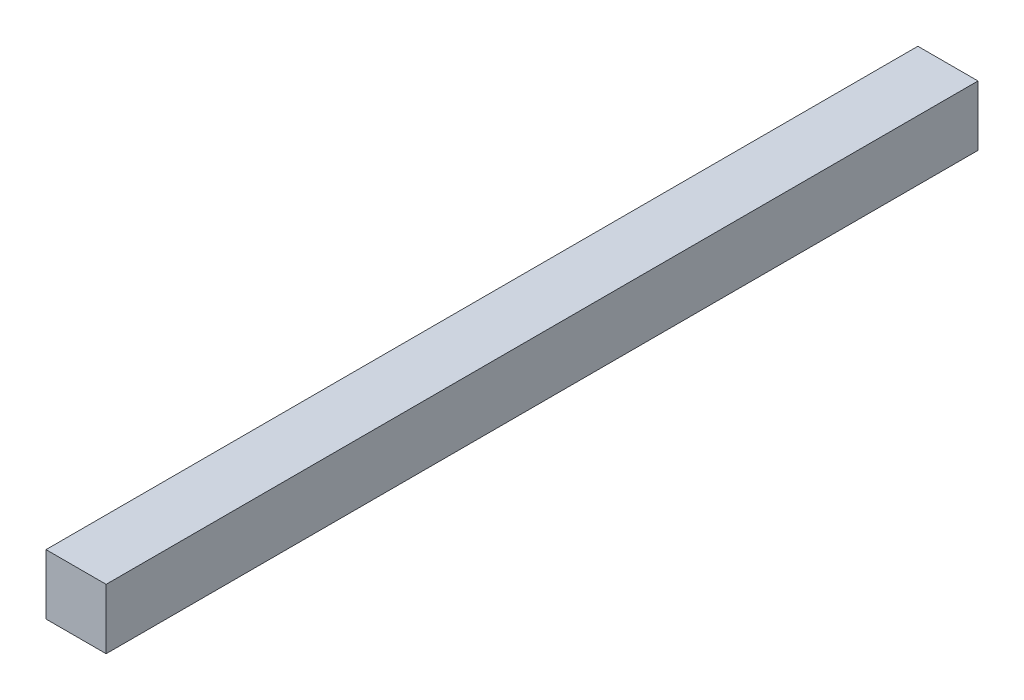
ISO-10303-21;
HEADER;
FILE_DESCRIPTION(('STEP AP214'),'2;1');
FILE_NAME('part.step','',(''),(''),'','','');
FILE_SCHEMA(('AUTOMOTIVE_DESIGN { 1 0 10303 214 1 1 1 1 }'));
ENDSEC;
DATA;
#1=APPLICATION_CONTEXT('core data for automotive mechanical design processes');
#2=APPLICATION_PROTOCOL_DEFINITION('international standard','automotive_design',2000,#1);
#3=PRODUCT_CONTEXT('',#1,'mechanical');
#4=PRODUCT('Part','Part','',(#3));
#5=PRODUCT_RELATED_PRODUCT_CATEGORY('part','',(#4));
#6=PRODUCT_DEFINITION_FORMATION('','',#4);
#7=PRODUCT_DEFINITION_CONTEXT('part definition',#1,'design');
#8=PRODUCT_DEFINITION('design','',#6,#7);
#9=PRODUCT_DEFINITION_SHAPE('','',#8);
#10=(LENGTH_UNIT() NAMED_UNIT(*) SI_UNIT(.MILLI.,.METRE.));
#11=(NAMED_UNIT(*) PLANE_ANGLE_UNIT() SI_UNIT($,.RADIAN.));
#12=(NAMED_UNIT(*) SI_UNIT($,.STERADIAN.) SOLID_ANGLE_UNIT());
#13=UNCERTAINTY_MEASURE_WITH_UNIT(LENGTH_MEASURE(1.E-05),#10,'distance_accuracy_value','');
#14=(GEOMETRIC_REPRESENTATION_CONTEXT(3) GLOBAL_UNCERTAINTY_ASSIGNED_CONTEXT((#13)) GLOBAL_UNIT_ASSIGNED_CONTEXT((#10,
#11,#12)) REPRESENTATION_CONTEXT('',''));
#15=CARTESIAN_POINT('',(0.,0.,0.));
#16=DIRECTION('',(0.,0.,1.));
#17=DIRECTION('',(1.,0.,0.));
#18=AXIS2_PLACEMENT_3D('',#15,#16,#17);
#19=CARTESIAN_POINT('',(0.,0.,552.45));
#20=DIRECTION('',(1.,0.,0.));
#21=DIRECTION('',(0.,0.,-1.));
#22=AXIS2_PLACEMENT_3D('',#19,#20,#21);
#23=PLANE('',#22);
#24=DIRECTION('',(0.,-1.,0.));
#25=VECTOR('',#24,1.);
#26=CARTESIAN_POINT('',(0.,0.,0.));
#27=LINE('',#26,#25);
#28=CARTESIAN_POINT('',(0.,38.1,0.));
#29=VERTEX_POINT('',#28);
#30=CARTESIAN_POINT('',(0.,0.,0.));
#31=VERTEX_POINT('',#30);
#32=EDGE_CURVE('E96',#29,#31,#27,.T.);
#33=ORIENTED_EDGE('',*,*,#32,.T.);
#34=DIRECTION('',(0.,0.,-1.));
#35=VECTOR('',#34,1.);
#36=CARTESIAN_POINT('',(0.,0.,552.45));
#37=LINE('',#36,#35);
#38=CARTESIAN_POINT('',(0.,0.,552.45));
#39=VERTEX_POINT('',#38);
#40=EDGE_CURVE('E11',#39,#31,#37,.T.);
#41=ORIENTED_EDGE('',*,*,#40,.F.);
#42=DIRECTION('',(0.,-1.,0.));
#43=VECTOR('',#42,1.);
#44=CARTESIAN_POINT('',(0.,0.,552.45));
#45=LINE('',#44,#43);
#46=CARTESIAN_POINT('',(0.,38.1,552.45));
#47=VERTEX_POINT('',#46);
#48=EDGE_CURVE('E84',#47,#39,#45,.T.);
#49=ORIENTED_EDGE('',*,*,#48,.F.);
#50=DIRECTION('',(0.,0.,-1.));
#51=VECTOR('',#50,1.);
#52=CARTESIAN_POINT('',(0.,38.1,552.45));
#53=LINE('',#52,#51);
#54=EDGE_CURVE('E92',#47,#29,#53,.T.);
#55=ORIENTED_EDGE('',*,*,#54,.T.);
#56=EDGE_LOOP('',(#33,#41,#49,#55));
#57=FACE_BOUND('',#56,.T.);
#58=ADVANCED_FACE('F33',(#57),#23,.F.);
#59=CARTESIAN_POINT('',(0.,0.,552.45));
#60=DIRECTION('',(0.,1.,0.));
#61=DIRECTION('',(0.,0.,1.));
#62=AXIS2_PLACEMENT_3D('',#59,#60,#61);
#63=PLANE('',#62);
#64=DIRECTION('',(1.,0.,0.));
#65=VECTOR('',#64,1.);
#66=CARTESIAN_POINT('',(0.,0.,0.));
#67=LINE('',#66,#65);
#68=CARTESIAN_POINT('',(38.1,0.,0.));
#69=VERTEX_POINT('',#68);
#70=EDGE_CURVE('E88',#31,#69,#67,.T.);
#71=ORIENTED_EDGE('',*,*,#70,.T.);
#72=DIRECTION('',(0.,0.,-1.));
#73=VECTOR('',#72,1.);
#74=CARTESIAN_POINT('',(38.1,0.,552.45));
#75=LINE('',#74,#73);
#76=CARTESIAN_POINT('',(38.1,0.,552.45));
#77=VERTEX_POINT('',#76);
#78=EDGE_CURVE('E41',#77,#69,#75,.T.);
#79=ORIENTED_EDGE('',*,*,#78,.F.);
#80=DIRECTION('',(1.,0.,0.));
#81=VECTOR('',#80,1.);
#82=CARTESIAN_POINT('',(0.,0.,552.45));
#83=LINE('',#82,#81);
#84=EDGE_CURVE('E79',#39,#77,#83,.T.);
#85=ORIENTED_EDGE('',*,*,#84,.F.);
#86=ORIENTED_EDGE('',*,*,#40,.T.);
#87=EDGE_LOOP('',(#71,#79,#85,#86));
#88=FACE_BOUND('',#87,.T.);
#89=ADVANCED_FACE('F87',(#88),#63,.F.);
#90=CARTESIAN_POINT('',(38.1,0.,552.45));
#91=DIRECTION('',(-1.,0.,0.));
#92=DIRECTION('',(0.,0.,1.));
#93=AXIS2_PLACEMENT_3D('',#90,#91,#92);
#94=PLANE('',#93);
#95=DIRECTION('',(0.,1.,0.));
#96=VECTOR('',#95,1.);
#97=CARTESIAN_POINT('',(38.1,0.,0.));
#98=LINE('',#97,#96);
#99=CARTESIAN_POINT('',(38.1,38.1,0.));
#100=VERTEX_POINT('',#99);
#101=EDGE_CURVE('E66',#69,#100,#98,.T.);
#102=ORIENTED_EDGE('',*,*,#101,.T.);
#103=DIRECTION('',(0.,0.,-1.));
#104=VECTOR('',#103,1.);
#105=CARTESIAN_POINT('',(38.1,38.1,552.45));
#106=LINE('',#105,#104);
#107=CARTESIAN_POINT('',(38.1,38.1,552.45));
#108=VERTEX_POINT('',#107);
#109=EDGE_CURVE('E89',#108,#100,#106,.T.);
#110=ORIENTED_EDGE('',*,*,#109,.F.);
#111=DIRECTION('',(0.,1.,0.));
#112=VECTOR('',#111,1.);
#113=CARTESIAN_POINT('',(38.1,0.,552.45));
#114=LINE('',#113,#112);
#115=EDGE_CURVE('E82',#77,#108,#114,.T.);
#116=ORIENTED_EDGE('',*,*,#115,.F.);
#117=ORIENTED_EDGE('',*,*,#78,.T.);
#118=EDGE_LOOP('',(#102,#110,#116,#117));
#119=FACE_BOUND('',#118,.T.);
#120=ADVANCED_FACE('F90',(#119),#94,.F.);
#121=CARTESIAN_POINT('',(0.,38.1,552.45));
#122=DIRECTION('',(0.,-1.,0.));
#123=DIRECTION('',(0.,0.,-1.));
#124=AXIS2_PLACEMENT_3D('',#121,#122,#123);
#125=PLANE('',#124);
#126=DIRECTION('',(-1.,0.,0.));
#127=VECTOR('',#126,1.);
#128=CARTESIAN_POINT('',(0.,38.1,0.));
#129=LINE('',#128,#127);
#130=EDGE_CURVE('E72',#100,#29,#129,.T.);
#131=ORIENTED_EDGE('',*,*,#130,.T.);
#132=ORIENTED_EDGE('',*,*,#54,.F.);
#133=DIRECTION('',(-1.,0.,0.));
#134=VECTOR('',#133,1.);
#135=CARTESIAN_POINT('',(0.,38.1,552.45));
#136=LINE('',#135,#134);
#137=EDGE_CURVE('E49',#108,#47,#136,.T.);
#138=ORIENTED_EDGE('',*,*,#137,.F.);
#139=ORIENTED_EDGE('',*,*,#109,.T.);
#140=EDGE_LOOP('',(#131,#132,#138,#139));
#141=FACE_BOUND('',#140,.T.);
#142=ADVANCED_FACE('F103',(#141),#125,.F.);
#143=CARTESIAN_POINT('',(0.,0.,552.45));
#144=DIRECTION('',(0.,0.,-1.));
#145=DIRECTION('',(-1.,0.,0.));
#146=AXIS2_PLACEMENT_3D('',#143,#144,#145);
#147=PLANE('',#146);
#148=ORIENTED_EDGE('',*,*,#48,.T.);
#149=ORIENTED_EDGE('',*,*,#84,.T.);
#150=ORIENTED_EDGE('',*,*,#115,.T.);
#151=ORIENTED_EDGE('',*,*,#137,.T.);
#152=EDGE_LOOP('',(#148,#149,#150,#151));
#153=FACE_BOUND('',#152,.T.);
#154=ADVANCED_FACE('F80',(#153),#147,.F.);
#155=CARTESIAN_POINT('',(0.,0.,0.));
#156=DIRECTION('',(0.,0.,-1.));
#157=DIRECTION('',(-1.,0.,0.));
#158=AXIS2_PLACEMENT_3D('',#155,#156,#157);
#159=PLANE('',#158);
#160=ORIENTED_EDGE('',*,*,#32,.F.);
#161=ORIENTED_EDGE('',*,*,#130,.F.);
#162=ORIENTED_EDGE('',*,*,#101,.F.);
#163=ORIENTED_EDGE('',*,*,#70,.F.);
#164=EDGE_LOOP('',(#160,#161,#162,#163));
#165=FACE_BOUND('',#164,.T.);
#166=ADVANCED_FACE('F106',(#165),#159,.T.);
#167=CLOSED_SHELL('',(#58,#89,#120,#142,#154,#166));
#168=MANIFOLD_SOLID_BREP('B2',#167);
#169=ADVANCED_BREP_SHAPE_REPRESENTATION('',(#18,#168),#14);
#170=SHAPE_DEFINITION_REPRESENTATION(#9,#169);
ENDSEC;
END-ISO-10303-21;
